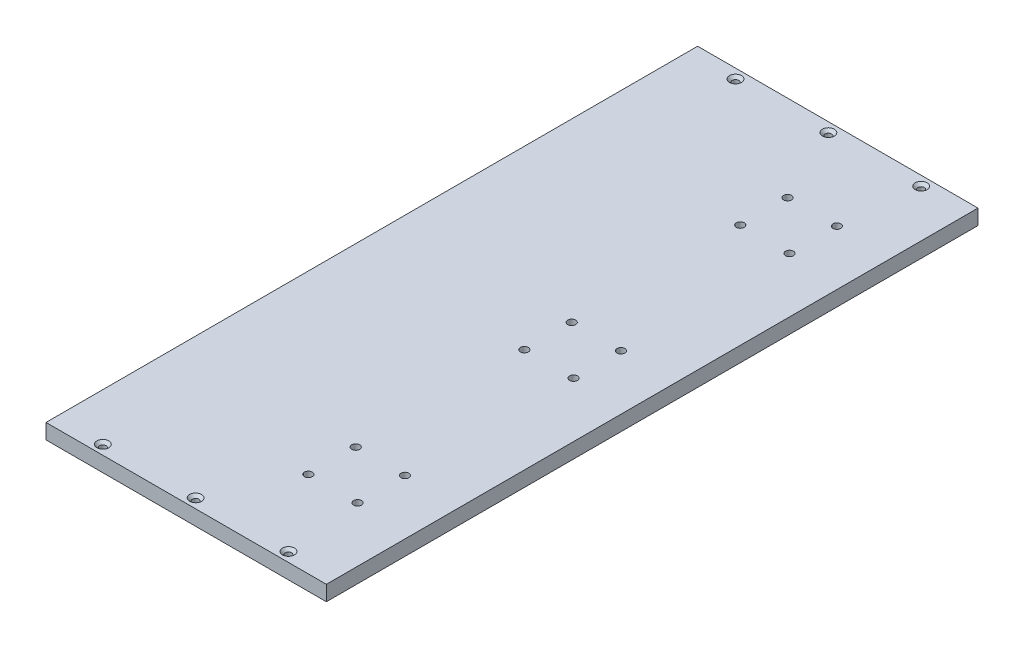
ISO-10303-21;
HEADER;
FILE_DESCRIPTION(('STEP AP214'),'2;1');
FILE_NAME('part.step','',(''),(''),'','','');
FILE_SCHEMA(('AUTOMOTIVE_DESIGN { 1 0 10303 214 1 1 1 1 }'));
ENDSEC;
DATA;
#1=APPLICATION_CONTEXT('core data for automotive mechanical design processes');
#2=APPLICATION_PROTOCOL_DEFINITION('international standard','automotive_design',2000,#1);
#3=PRODUCT_CONTEXT('',#1,'mechanical');
#4=PRODUCT('Part','Part','',(#3));
#5=PRODUCT_RELATED_PRODUCT_CATEGORY('part','',(#4));
#6=PRODUCT_DEFINITION_FORMATION('','',#4);
#7=PRODUCT_DEFINITION_CONTEXT('part definition',#1,'design');
#8=PRODUCT_DEFINITION('design','',#6,#7);
#9=PRODUCT_DEFINITION_SHAPE('','',#8);
#10=(LENGTH_UNIT() NAMED_UNIT(*) SI_UNIT(.MILLI.,.METRE.));
#11=(NAMED_UNIT(*) PLANE_ANGLE_UNIT() SI_UNIT($,.RADIAN.));
#12=(NAMED_UNIT(*) SI_UNIT($,.STERADIAN.) SOLID_ANGLE_UNIT());
#13=UNCERTAINTY_MEASURE_WITH_UNIT(LENGTH_MEASURE(1.E-05),#10,'distance_accuracy_value','');
#14=(GEOMETRIC_REPRESENTATION_CONTEXT(3) GLOBAL_UNCERTAINTY_ASSIGNED_CONTEXT((#13)) GLOBAL_UNIT_ASSIGNED_CONTEXT((#10,
#11,#12)) REPRESENTATION_CONTEXT('',''));
#15=CARTESIAN_POINT('',(0.,0.,0.));
#16=DIRECTION('',(0.,0.,1.));
#17=DIRECTION('',(1.,0.,0.));
#18=AXIS2_PLACEMENT_3D('',#15,#16,#17);
#19=CARTESIAN_POINT('',(0.,8.,0.));
#20=DIRECTION('',(0.,-1.,0.));
#21=DIRECTION('',(0.,0.,-1.));
#22=AXIS2_PLACEMENT_3D('',#19,#20,#21);
#23=PLANE('',#22);
#24=CARTESIAN_POINT('',(45.,8.,-101.5));
#25=DIRECTION('',(0.,1.,0.));
#26=DIRECTION('',(0.,0.,1.));
#27=AXIS2_PLACEMENT_3D('',#24,#25,#26);
#28=CIRCLE('',#27,2.1);
#29=CARTESIAN_POINT('',(45.,8.,-99.4));
#30=VERTEX_POINT('',#29);
#31=EDGE_CURVE('E254',#30,#30,#28,.T.);
#32=ORIENTED_EDGE('',*,*,#31,.F.);
#33=EDGE_LOOP('',(#32));
#34=FACE_BOUND('',#33,.T.);
#35=CARTESIAN_POINT('',(19.,8.,-12.5));
#36=DIRECTION('',(0.,1.,0.));
#37=DIRECTION('',(0.,0.,1.));
#38=AXIS2_PLACEMENT_3D('',#35,#36,#37);
#39=CIRCLE('',#38,2.1);
#40=CARTESIAN_POINT('',(19.,8.,-10.4));
#41=VERTEX_POINT('',#40);
#42=EDGE_CURVE('E266',#41,#41,#39,.T.);
#43=ORIENTED_EDGE('',*,*,#42,.F.);
#44=EDGE_LOOP('',(#43));
#45=FACE_BOUND('',#44,.T.);
#46=CARTESIAN_POINT('',(19.,8.,12.5));
#47=DIRECTION('',(0.,1.,0.));
#48=DIRECTION('',(0.,0.,1.));
#49=AXIS2_PLACEMENT_3D('',#46,#47,#48);
#50=CIRCLE('',#49,2.1);
#51=CARTESIAN_POINT('',(19.,8.,14.6));
#52=VERTEX_POINT('',#51);
#53=EDGE_CURVE('E272',#52,#52,#50,.T.);
#54=ORIENTED_EDGE('',*,*,#53,.F.);
#55=EDGE_LOOP('',(#54));
#56=FACE_BOUND('',#55,.T.);
#57=CARTESIAN_POINT('',(45.,8.,12.5));
#58=DIRECTION('',(0.,1.,0.));
#59=DIRECTION('',(0.,0.,1.));
#60=AXIS2_PLACEMENT_3D('',#57,#58,#59);
#61=CIRCLE('',#60,2.1);
#62=CARTESIAN_POINT('',(45.,8.,14.6));
#63=VERTEX_POINT('',#62);
#64=EDGE_CURVE('E278',#63,#63,#61,.T.);
#65=ORIENTED_EDGE('',*,*,#64,.F.);
#66=EDGE_LOOP('',(#65));
#67=FACE_BOUND('',#66,.T.);
#68=CARTESIAN_POINT('',(-49.,8.,-167.));
#69=DIRECTION('',(0.,1.,0.));
#70=DIRECTION('',(0.,0.,1.));
#71=AXIS2_PLACEMENT_3D('',#68,#69,#70);
#72=CIRCLE('',#71,3.15);
#73=CARTESIAN_POINT('',(-49.,8.,-163.85));
#74=VERTEX_POINT('',#73);
#75=EDGE_CURVE('E284',#74,#74,#72,.T.);
#76=ORIENTED_EDGE('',*,*,#75,.F.);
#77=EDGE_LOOP('',(#76));
#78=FACE_BOUND('',#77,.T.);
#79=CARTESIAN_POINT('',(-49.,8.,167.));
#80=DIRECTION('',(0.,1.,0.));
#81=DIRECTION('',(0.,0.,1.));
#82=AXIS2_PLACEMENT_3D('',#79,#80,#81);
#83=CIRCLE('',#82,3.15);
#84=CARTESIAN_POINT('',(-49.,8.,170.15));
#85=VERTEX_POINT('',#84);
#86=EDGE_CURVE('E139',#85,#85,#83,.T.);
#87=ORIENTED_EDGE('',*,*,#86,.F.);
#88=EDGE_LOOP('',(#87));
#89=FACE_BOUND('',#88,.T.);
#90=CARTESIAN_POINT('',(0.,8.,167.));
#91=DIRECTION('',(0.,1.,0.));
#92=DIRECTION('',(0.,0.,1.));
#93=AXIS2_PLACEMENT_3D('',#90,#91,#92);
#94=CIRCLE('',#93,3.15);
#95=CARTESIAN_POINT('',(0.,8.,170.15));
#96=VERTEX_POINT('',#95);
#97=EDGE_CURVE('E135',#96,#96,#94,.T.);
#98=ORIENTED_EDGE('',*,*,#97,.F.);
#99=EDGE_LOOP('',(#98));
#100=FACE_BOUND('',#99,.T.);
#101=CARTESIAN_POINT('',(49.,8.,167.));
#102=DIRECTION('',(0.,1.,0.));
#103=DIRECTION('',(0.,0.,1.));
#104=AXIS2_PLACEMENT_3D('',#101,#102,#103);
#105=CIRCLE('',#104,3.15);
#106=CARTESIAN_POINT('',(49.,8.,170.15));
#107=VERTEX_POINT('',#106);
#108=EDGE_CURVE('E130',#107,#107,#105,.T.);
#109=ORIENTED_EDGE('',*,*,#108,.F.);
#110=EDGE_LOOP('',(#109));
#111=FACE_BOUND('',#110,.T.);
#112=DIRECTION('',(0.,0.,-1.));
#113=VECTOR('',#112,1.);
#114=CARTESIAN_POINT('',(74.,8.,172.));
#115=LINE('',#114,#113);
#116=CARTESIAN_POINT('',(74.,8.,172.));
#117=VERTEX_POINT('',#116);
#118=CARTESIAN_POINT('',(74.,8.,-172.));
#119=VERTEX_POINT('',#118);
#120=EDGE_CURVE('E102',#117,#119,#115,.T.);
#121=ORIENTED_EDGE('',*,*,#120,.T.);
#122=DIRECTION('',(-1.,0.,0.));
#123=VECTOR('',#122,1.);
#124=CARTESIAN_POINT('',(-74.,8.,-172.));
#125=LINE('',#124,#123);
#126=CARTESIAN_POINT('',(-74.,8.,-172.));
#127=VERTEX_POINT('',#126);
#128=EDGE_CURVE('E97',#119,#127,#125,.T.);
#129=ORIENTED_EDGE('',*,*,#128,.T.);
#130=DIRECTION('',(0.,0.,1.));
#131=VECTOR('',#130,1.);
#132=CARTESIAN_POINT('',(-74.,8.,172.));
#133=LINE('',#132,#131);
#134=CARTESIAN_POINT('',(-74.,8.,172.));
#135=VERTEX_POINT('',#134);
#136=EDGE_CURVE('E100',#127,#135,#133,.T.);
#137=ORIENTED_EDGE('',*,*,#136,.T.);
#138=DIRECTION('',(1.,0.,0.));
#139=VECTOR('',#138,1.);
#140=CARTESIAN_POINT('',(-74.,8.,172.));
#141=LINE('',#140,#139);
#142=EDGE_CURVE('E67',#135,#117,#141,.T.);
#143=ORIENTED_EDGE('',*,*,#142,.T.);
#144=EDGE_LOOP('',(#121,#129,#137,#143));
#145=FACE_BOUND('',#144,.T.);
#146=CARTESIAN_POINT('',(49.,8.,-167.));
#147=DIRECTION('',(0.,1.,0.));
#148=DIRECTION('',(0.,0.,1.));
#149=AXIS2_PLACEMENT_3D('',#146,#147,#148);
#150=CIRCLE('',#149,3.15);
#151=CARTESIAN_POINT('',(49.,8.,-163.85));
#152=VERTEX_POINT('',#151);
#153=EDGE_CURVE('E143',#152,#152,#150,.T.);
#154=ORIENTED_EDGE('',*,*,#153,.F.);
#155=EDGE_LOOP('',(#154));
#156=FACE_BOUND('',#155,.T.);
#157=CARTESIAN_POINT('',(0.,8.,-167.));
#158=DIRECTION('',(0.,1.,0.));
#159=DIRECTION('',(0.,0.,1.));
#160=AXIS2_PLACEMENT_3D('',#157,#158,#159);
#161=CIRCLE('',#160,3.15);
#162=CARTESIAN_POINT('',(0.,8.,-163.85));
#163=VERTEX_POINT('',#162);
#164=EDGE_CURVE('E150',#163,#163,#161,.T.);
#165=ORIENTED_EDGE('',*,*,#164,.F.);
#166=EDGE_LOOP('',(#165));
#167=FACE_BOUND('',#166,.T.);
#168=CARTESIAN_POINT('',(45.,8.,-12.5));
#169=DIRECTION('',(0.,1.,0.));
#170=DIRECTION('',(0.,0.,1.));
#171=AXIS2_PLACEMENT_3D('',#168,#169,#170);
#172=CIRCLE('',#171,2.1);
#173=CARTESIAN_POINT('',(45.,8.,-10.4));
#174=VERTEX_POINT('',#173);
#175=EDGE_CURVE('E260',#174,#174,#172,.T.);
#176=ORIENTED_EDGE('',*,*,#175,.F.);
#177=EDGE_LOOP('',(#176));
#178=FACE_BOUND('',#177,.T.);
#179=CARTESIAN_POINT('',(19.,8.,-101.5));
#180=DIRECTION('',(0.,1.,0.));
#181=DIRECTION('',(0.,0.,1.));
#182=AXIS2_PLACEMENT_3D('',#179,#180,#181);
#183=CIRCLE('',#182,2.1);
#184=CARTESIAN_POINT('',(19.,8.,-99.4));
#185=VERTEX_POINT('',#184);
#186=EDGE_CURVE('E250',#185,#185,#183,.T.);
#187=ORIENTED_EDGE('',*,*,#186,.F.);
#188=EDGE_LOOP('',(#187));
#189=FACE_BOUND('',#188,.T.);
#190=CARTESIAN_POINT('',(19.,8.,-126.5));
#191=DIRECTION('',(0.,1.,0.));
#192=DIRECTION('',(0.,0.,1.));
#193=AXIS2_PLACEMENT_3D('',#190,#191,#192);
#194=CIRCLE('',#193,2.1);
#195=CARTESIAN_POINT('',(19.,8.,-124.4));
#196=VERTEX_POINT('',#195);
#197=EDGE_CURVE('E244',#196,#196,#194,.T.);
#198=ORIENTED_EDGE('',*,*,#197,.F.);
#199=EDGE_LOOP('',(#198));
#200=FACE_BOUND('',#199,.T.);
#201=CARTESIAN_POINT('',(45.,8.,-126.5));
#202=DIRECTION('',(0.,1.,0.));
#203=DIRECTION('',(0.,0.,1.));
#204=AXIS2_PLACEMENT_3D('',#201,#202,#203);
#205=CIRCLE('',#204,2.1);
#206=CARTESIAN_POINT('',(45.,8.,-124.4));
#207=VERTEX_POINT('',#206);
#208=EDGE_CURVE('E238',#207,#207,#205,.T.);
#209=ORIENTED_EDGE('',*,*,#208,.F.);
#210=EDGE_LOOP('',(#209));
#211=FACE_BOUND('',#210,.T.);
#212=CARTESIAN_POINT('',(45.,8.,126.5));
#213=DIRECTION('',(0.,1.,0.));
#214=DIRECTION('',(0.,0.,1.));
#215=AXIS2_PLACEMENT_3D('',#212,#213,#214);
#216=CIRCLE('',#215,2.1);
#217=CARTESIAN_POINT('',(45.,8.,128.6));
#218=VERTEX_POINT('',#217);
#219=EDGE_CURVE('E232',#218,#218,#216,.T.);
#220=ORIENTED_EDGE('',*,*,#219,.F.);
#221=EDGE_LOOP('',(#220));
#222=FACE_BOUND('',#221,.T.);
#223=CARTESIAN_POINT('',(19.,8.,126.5));
#224=DIRECTION('',(0.,1.,0.));
#225=DIRECTION('',(0.,0.,1.));
#226=AXIS2_PLACEMENT_3D('',#223,#224,#225);
#227=CIRCLE('',#226,2.1);
#228=CARTESIAN_POINT('',(19.,8.,128.6));
#229=VERTEX_POINT('',#228);
#230=EDGE_CURVE('E221',#229,#229,#227,.T.);
#231=ORIENTED_EDGE('',*,*,#230,.F.);
#232=EDGE_LOOP('',(#231));
#233=FACE_BOUND('',#232,.T.);
#234=CARTESIAN_POINT('',(19.,8.,101.5));
#235=DIRECTION('',(0.,1.,0.));
#236=DIRECTION('',(0.,0.,1.));
#237=AXIS2_PLACEMENT_3D('',#234,#235,#236);
#238=CIRCLE('',#237,2.1);
#239=CARTESIAN_POINT('',(19.,8.,103.6));
#240=VERTEX_POINT('',#239);
#241=EDGE_CURVE('E222',#240,#240,#238,.T.);
#242=ORIENTED_EDGE('',*,*,#241,.F.);
#243=EDGE_LOOP('',(#242));
#244=FACE_BOUND('',#243,.T.);
#245=CARTESIAN_POINT('',(45.,8.,101.5));
#246=DIRECTION('',(0.,1.,0.));
#247=DIRECTION('',(0.,0.,1.));
#248=AXIS2_PLACEMENT_3D('',#245,#246,#247);
#249=CIRCLE('',#248,2.1);
#250=CARTESIAN_POINT('',(45.,8.,103.6));
#251=VERTEX_POINT('',#250);
#252=EDGE_CURVE('E592',#251,#251,#249,.T.);
#253=ORIENTED_EDGE('',*,*,#252,.F.);
#254=EDGE_LOOP('',(#253));
#255=FACE_BOUND('',#254,.T.);
#256=ADVANCED_FACE('F48',(#34,#45,#56,#67,#78,#89,#100,#111,#145,#156,#167,#178,#189,#200,#211,
#222,#233,#244,#255),#23,.F.);
#257=CARTESIAN_POINT('',(0.,0.,0.));
#258=DIRECTION('',(0.,-1.,0.));
#259=DIRECTION('',(0.,0.,-1.));
#260=AXIS2_PLACEMENT_3D('',#257,#258,#259);
#261=PLANE('',#260);
#262=CARTESIAN_POINT('',(45.,0.,101.5));
#263=DIRECTION('',(0.,1.,0.));
#264=DIRECTION('',(0.,0.,1.));
#265=AXIS2_PLACEMENT_3D('',#262,#263,#264);
#266=CIRCLE('',#265,2.1);
#267=CARTESIAN_POINT('',(45.,0.,103.6));
#268=VERTEX_POINT('',#267);
#269=EDGE_CURVE('E227',#268,#268,#266,.T.);
#270=ORIENTED_EDGE('',*,*,#269,.T.);
#271=EDGE_LOOP('',(#270));
#272=FACE_BOUND('',#271,.T.);
#273=CARTESIAN_POINT('',(45.,0.,126.5));
#274=DIRECTION('',(0.,1.,0.));
#275=DIRECTION('',(0.,0.,1.));
#276=AXIS2_PLACEMENT_3D('',#273,#274,#275);
#277=CIRCLE('',#276,2.1);
#278=CARTESIAN_POINT('',(45.,0.,128.6));
#279=VERTEX_POINT('',#278);
#280=EDGE_CURVE('E235',#279,#279,#277,.T.);
#281=ORIENTED_EDGE('',*,*,#280,.T.);
#282=EDGE_LOOP('',(#281));
#283=FACE_BOUND('',#282,.T.);
#284=CARTESIAN_POINT('',(45.,0.,-126.5));
#285=DIRECTION('',(0.,1.,0.));
#286=DIRECTION('',(0.,0.,1.));
#287=AXIS2_PLACEMENT_3D('',#284,#285,#286);
#288=CIRCLE('',#287,2.1);
#289=CARTESIAN_POINT('',(45.,0.,-124.4));
#290=VERTEX_POINT('',#289);
#291=EDGE_CURVE('E241',#290,#290,#288,.T.);
#292=ORIENTED_EDGE('',*,*,#291,.T.);
#293=EDGE_LOOP('',(#292));
#294=FACE_BOUND('',#293,.T.);
#295=CARTESIAN_POINT('',(19.,0.,-126.5));
#296=DIRECTION('',(0.,1.,0.));
#297=DIRECTION('',(0.,0.,1.));
#298=AXIS2_PLACEMENT_3D('',#295,#296,#297);
#299=CIRCLE('',#298,2.1);
#300=CARTESIAN_POINT('',(19.,0.,-124.4));
#301=VERTEX_POINT('',#300);
#302=EDGE_CURVE('E247',#301,#301,#299,.T.);
#303=ORIENTED_EDGE('',*,*,#302,.T.);
#304=EDGE_LOOP('',(#303));
#305=FACE_BOUND('',#304,.T.);
#306=CARTESIAN_POINT('',(45.,0.,-101.5));
#307=DIRECTION('',(0.,1.,0.));
#308=DIRECTION('',(0.,0.,1.));
#309=AXIS2_PLACEMENT_3D('',#306,#307,#308);
#310=CIRCLE('',#309,2.1);
#311=CARTESIAN_POINT('',(45.,0.,-99.4));
#312=VERTEX_POINT('',#311);
#313=EDGE_CURVE('E257',#312,#312,#310,.T.);
#314=ORIENTED_EDGE('',*,*,#313,.T.);
#315=EDGE_LOOP('',(#314));
#316=FACE_BOUND('',#315,.T.);
#317=CARTESIAN_POINT('',(45.,0.,-12.5));
#318=DIRECTION('',(0.,1.,0.));
#319=DIRECTION('',(0.,0.,1.));
#320=AXIS2_PLACEMENT_3D('',#317,#318,#319);
#321=CIRCLE('',#320,2.1);
#322=CARTESIAN_POINT('',(45.,0.,-10.4));
#323=VERTEX_POINT('',#322);
#324=EDGE_CURVE('E263',#323,#323,#321,.T.);
#325=ORIENTED_EDGE('',*,*,#324,.T.);
#326=EDGE_LOOP('',(#325));
#327=FACE_BOUND('',#326,.T.);
#328=CARTESIAN_POINT('',(19.,0.,-12.5));
#329=DIRECTION('',(0.,1.,0.));
#330=DIRECTION('',(0.,0.,1.));
#331=AXIS2_PLACEMENT_3D('',#328,#329,#330);
#332=CIRCLE('',#331,2.1);
#333=CARTESIAN_POINT('',(19.,0.,-10.4));
#334=VERTEX_POINT('',#333);
#335=EDGE_CURVE('E269',#334,#334,#332,.T.);
#336=ORIENTED_EDGE('',*,*,#335,.T.);
#337=EDGE_LOOP('',(#336));
#338=FACE_BOUND('',#337,.T.);
#339=CARTESIAN_POINT('',(19.,0.,12.5));
#340=DIRECTION('',(0.,1.,0.));
#341=DIRECTION('',(0.,0.,1.));
#342=AXIS2_PLACEMENT_3D('',#339,#340,#341);
#343=CIRCLE('',#342,2.1);
#344=CARTESIAN_POINT('',(19.,0.,14.6));
#345=VERTEX_POINT('',#344);
#346=EDGE_CURVE('E275',#345,#345,#343,.T.);
#347=ORIENTED_EDGE('',*,*,#346,.T.);
#348=EDGE_LOOP('',(#347));
#349=FACE_BOUND('',#348,.T.);
#350=CARTESIAN_POINT('',(45.,0.,12.5));
#351=DIRECTION('',(0.,1.,0.));
#352=DIRECTION('',(0.,0.,1.));
#353=AXIS2_PLACEMENT_3D('',#350,#351,#352);
#354=CIRCLE('',#353,2.1);
#355=CARTESIAN_POINT('',(45.,0.,14.6));
#356=VERTEX_POINT('',#355);
#357=EDGE_CURVE('E281',#356,#356,#354,.T.);
#358=ORIENTED_EDGE('',*,*,#357,.T.);
#359=EDGE_LOOP('',(#358));
#360=FACE_BOUND('',#359,.T.);
#361=CARTESIAN_POINT('',(-49.,0.,-167.));
#362=DIRECTION('',(0.,-1.,0.));
#363=DIRECTION('',(0.,0.,-1.));
#364=AXIS2_PLACEMENT_3D('',#361,#362,#363);
#365=CIRCLE('',#364,1.7);
#366=CARTESIAN_POINT('',(-49.,0.,-168.7));
#367=VERTEX_POINT('',#366);
#368=EDGE_CURVE('E52',#367,#367,#365,.T.);
#369=ORIENTED_EDGE('',*,*,#368,.F.);
#370=EDGE_LOOP('',(#369));
#371=FACE_BOUND('',#370,.T.);
#372=CARTESIAN_POINT('',(0.,0.,-167.));
#373=DIRECTION('',(0.,-1.,0.));
#374=DIRECTION('',(0.,0.,-1.));
#375=AXIS2_PLACEMENT_3D('',#372,#373,#374);
#376=CIRCLE('',#375,1.7);
#377=CARTESIAN_POINT('',(0.,0.,-168.7));
#378=VERTEX_POINT('',#377);
#379=EDGE_CURVE('E141',#378,#378,#376,.T.);
#380=ORIENTED_EDGE('',*,*,#379,.F.);
#381=EDGE_LOOP('',(#380));
#382=FACE_BOUND('',#381,.T.);
#383=CARTESIAN_POINT('',(49.,0.,-167.));
#384=DIRECTION('',(0.,-1.,0.));
#385=DIRECTION('',(0.,0.,-1.));
#386=AXIS2_PLACEMENT_3D('',#383,#384,#385);
#387=CIRCLE('',#386,1.7);
#388=CARTESIAN_POINT('',(49.,0.,-168.7));
#389=VERTEX_POINT('',#388);
#390=EDGE_CURVE('E137',#389,#389,#387,.T.);
#391=ORIENTED_EDGE('',*,*,#390,.F.);
#392=EDGE_LOOP('',(#391));
#393=FACE_BOUND('',#392,.T.);
#394=CARTESIAN_POINT('',(-49.,0.,167.));
#395=DIRECTION('',(0.,-1.,0.));
#396=DIRECTION('',(0.,0.,-1.));
#397=AXIS2_PLACEMENT_3D('',#394,#395,#396);
#398=CIRCLE('',#397,1.7);
#399=CARTESIAN_POINT('',(-49.,0.,165.3));
#400=VERTEX_POINT('',#399);
#401=EDGE_CURVE('E132',#400,#400,#398,.T.);
#402=ORIENTED_EDGE('',*,*,#401,.F.);
#403=EDGE_LOOP('',(#402));
#404=FACE_BOUND('',#403,.T.);
#405=CARTESIAN_POINT('',(0.,0.,167.));
#406=DIRECTION('',(0.,-1.,0.));
#407=DIRECTION('',(0.,0.,-1.));
#408=AXIS2_PLACEMENT_3D('',#405,#406,#407);
#409=CIRCLE('',#408,1.7);
#410=CARTESIAN_POINT('',(0.,0.,165.3));
#411=VERTEX_POINT('',#410);
#412=EDGE_CURVE('E127',#411,#411,#409,.T.);
#413=ORIENTED_EDGE('',*,*,#412,.F.);
#414=EDGE_LOOP('',(#413));
#415=FACE_BOUND('',#414,.T.);
#416=CARTESIAN_POINT('',(49.,0.,167.));
#417=DIRECTION('',(0.,-1.,0.));
#418=DIRECTION('',(0.,0.,-1.));
#419=AXIS2_PLACEMENT_3D('',#416,#417,#418);
#420=CIRCLE('',#419,1.7);
#421=CARTESIAN_POINT('',(49.,0.,165.3));
#422=VERTEX_POINT('',#421);
#423=EDGE_CURVE('E118',#422,#422,#420,.T.);
#424=ORIENTED_EDGE('',*,*,#423,.F.);
#425=EDGE_LOOP('',(#424));
#426=FACE_BOUND('',#425,.T.);
#427=DIRECTION('',(0.,0.,-1.));
#428=VECTOR('',#427,1.);
#429=CARTESIAN_POINT('',(74.,0.,172.));
#430=LINE('',#429,#428);
#431=CARTESIAN_POINT('',(74.,0.,172.));
#432=VERTEX_POINT('',#431);
#433=CARTESIAN_POINT('',(74.,0.,-172.));
#434=VERTEX_POINT('',#433);
#435=EDGE_CURVE('E115',#432,#434,#430,.T.);
#436=ORIENTED_EDGE('',*,*,#435,.F.);
#437=DIRECTION('',(1.,0.,0.));
#438=VECTOR('',#437,1.);
#439=CARTESIAN_POINT('',(-74.,0.,172.));
#440=LINE('',#439,#438);
#441=CARTESIAN_POINT('',(-74.,0.,172.));
#442=VERTEX_POINT('',#441);
#443=EDGE_CURVE('E90',#442,#432,#440,.T.);
#444=ORIENTED_EDGE('',*,*,#443,.F.);
#445=DIRECTION('',(0.,0.,1.));
#446=VECTOR('',#445,1.);
#447=CARTESIAN_POINT('',(-74.,0.,172.));
#448=LINE('',#447,#446);
#449=CARTESIAN_POINT('',(-74.,0.,-172.));
#450=VERTEX_POINT('',#449);
#451=EDGE_CURVE('E84',#450,#442,#448,.T.);
#452=ORIENTED_EDGE('',*,*,#451,.F.);
#453=DIRECTION('',(-1.,0.,0.));
#454=VECTOR('',#453,1.);
#455=CARTESIAN_POINT('',(-74.,0.,-172.));
#456=LINE('',#455,#454);
#457=EDGE_CURVE('E106',#434,#450,#456,.T.);
#458=ORIENTED_EDGE('',*,*,#457,.F.);
#459=EDGE_LOOP('',(#436,#444,#452,#458));
#460=FACE_BOUND('',#459,.T.);
#461=CARTESIAN_POINT('',(19.,0.,-101.5));
#462=DIRECTION('',(0.,1.,0.));
#463=DIRECTION('',(0.,0.,1.));
#464=AXIS2_PLACEMENT_3D('',#461,#462,#463);
#465=CIRCLE('',#464,2.1);
#466=CARTESIAN_POINT('',(19.,0.,-99.4));
#467=VERTEX_POINT('',#466);
#468=EDGE_CURVE('E212',#467,#467,#465,.T.);
#469=ORIENTED_EDGE('',*,*,#468,.T.);
#470=EDGE_LOOP('',(#469));
#471=FACE_BOUND('',#470,.T.);
#472=CARTESIAN_POINT('',(19.,0.,126.5));
#473=DIRECTION('',(0.,1.,0.));
#474=DIRECTION('',(0.,0.,1.));
#475=AXIS2_PLACEMENT_3D('',#472,#473,#474);
#476=CIRCLE('',#475,2.1);
#477=CARTESIAN_POINT('',(19.,0.,128.6));
#478=VERTEX_POINT('',#477);
#479=EDGE_CURVE('E216',#478,#478,#476,.T.);
#480=ORIENTED_EDGE('',*,*,#479,.T.);
#481=EDGE_LOOP('',(#480));
#482=FACE_BOUND('',#481,.T.);
#483=CARTESIAN_POINT('',(19.,0.,101.5));
#484=DIRECTION('',(0.,1.,0.));
#485=DIRECTION('',(0.,0.,1.));
#486=AXIS2_PLACEMENT_3D('',#483,#484,#485);
#487=CIRCLE('',#486,2.1);
#488=CARTESIAN_POINT('',(19.,0.,103.6));
#489=VERTEX_POINT('',#488);
#490=EDGE_CURVE('E219',#489,#489,#487,.T.);
#491=ORIENTED_EDGE('',*,*,#490,.T.);
#492=EDGE_LOOP('',(#491));
#493=FACE_BOUND('',#492,.T.);
#494=ADVANCED_FACE('F183',(#272,#283,#294,#305,#316,#327,#338,#349,#360,#371,#382,#393,#404,
#415,#426,#460,#471,#482,#493),#261,.T.);
#495=CARTESIAN_POINT('',(74.,8.,172.));
#496=DIRECTION('',(-1.,0.,0.));
#497=DIRECTION('',(0.,0.,1.));
#498=AXIS2_PLACEMENT_3D('',#495,#496,#497);
#499=PLANE('',#498);
#500=ORIENTED_EDGE('',*,*,#435,.T.);
#501=DIRECTION('',(0.,-1.,0.));
#502=VECTOR('',#501,1.);
#503=CARTESIAN_POINT('',(74.,8.,-172.));
#504=LINE('',#503,#502);
#505=EDGE_CURVE('E13',#119,#434,#504,.T.);
#506=ORIENTED_EDGE('',*,*,#505,.F.);
#507=ORIENTED_EDGE('',*,*,#120,.F.);
#508=DIRECTION('',(0.,-1.,0.));
#509=VECTOR('',#508,1.);
#510=CARTESIAN_POINT('',(74.,8.,172.));
#511=LINE('',#510,#509);
#512=EDGE_CURVE('E111',#117,#432,#511,.T.);
#513=ORIENTED_EDGE('',*,*,#512,.T.);
#514=EDGE_LOOP('',(#500,#506,#507,#513));
#515=FACE_BOUND('',#514,.T.);
#516=ADVANCED_FACE('F50',(#515),#499,.F.);
#517=CARTESIAN_POINT('',(-74.,8.,-172.));
#518=DIRECTION('',(0.,0.,1.));
#519=DIRECTION('',(1.,0.,0.));
#520=AXIS2_PLACEMENT_3D('',#517,#518,#519);
#521=PLANE('',#520);
#522=ORIENTED_EDGE('',*,*,#457,.T.);
#523=DIRECTION('',(0.,-1.,0.));
#524=VECTOR('',#523,1.);
#525=CARTESIAN_POINT('',(-74.,8.,-172.));
#526=LINE('',#525,#524);
#527=EDGE_CURVE('E58',#127,#450,#526,.T.);
#528=ORIENTED_EDGE('',*,*,#527,.F.);
#529=ORIENTED_EDGE('',*,*,#128,.F.);
#530=ORIENTED_EDGE('',*,*,#505,.T.);
#531=EDGE_LOOP('',(#522,#528,#529,#530));
#532=FACE_BOUND('',#531,.T.);
#533=ADVANCED_FACE('F105',(#532),#521,.F.);
#534=CARTESIAN_POINT('',(-74.,8.,172.));
#535=DIRECTION('',(1.,0.,0.));
#536=DIRECTION('',(0.,0.,-1.));
#537=AXIS2_PLACEMENT_3D('',#534,#535,#536);
#538=PLANE('',#537);
#539=ORIENTED_EDGE('',*,*,#451,.T.);
#540=DIRECTION('',(0.,-1.,0.));
#541=VECTOR('',#540,1.);
#542=CARTESIAN_POINT('',(-74.,8.,172.));
#543=LINE('',#542,#541);
#544=EDGE_CURVE('E107',#135,#442,#543,.T.);
#545=ORIENTED_EDGE('',*,*,#544,.F.);
#546=ORIENTED_EDGE('',*,*,#136,.F.);
#547=ORIENTED_EDGE('',*,*,#527,.T.);
#548=EDGE_LOOP('',(#539,#545,#546,#547));
#549=FACE_BOUND('',#548,.T.);
#550=ADVANCED_FACE('F109',(#549),#538,.F.);
#551=CARTESIAN_POINT('',(-74.,8.,172.));
#552=DIRECTION('',(0.,0.,-1.));
#553=DIRECTION('',(-1.,0.,0.));
#554=AXIS2_PLACEMENT_3D('',#551,#552,#553);
#555=PLANE('',#554);
#556=ORIENTED_EDGE('',*,*,#443,.T.);
#557=ORIENTED_EDGE('',*,*,#512,.F.);
#558=ORIENTED_EDGE('',*,*,#142,.F.);
#559=ORIENTED_EDGE('',*,*,#544,.T.);
#560=EDGE_LOOP('',(#556,#557,#558,#559));
#561=FACE_BOUND('',#560,.T.);
#562=ADVANCED_FACE('F195',(#561),#555,.F.);
#563=CARTESIAN_POINT('',(49.,8.,167.));
#564=DIRECTION('',(0.,1.,0.));
#565=DIRECTION('',(0.,0.,1.));
#566=AXIS2_PLACEMENT_3D('',#563,#564,#565);
#567=CYLINDRICAL_SURFACE('',#566,1.7);
#568=ORIENTED_EDGE('',*,*,#423,.T.);
#569=EDGE_LOOP('',(#568));
#570=FACE_BOUND('',#569,.T.);
#571=CARTESIAN_POINT('',(49.,6.55,167.));
#572=DIRECTION('',(0.,1.,0.));
#573=DIRECTION('',(0.,0.,1.));
#574=AXIS2_PLACEMENT_3D('',#571,#572,#573);
#575=CIRCLE('',#574,1.7);
#576=CARTESIAN_POINT('',(49.,6.55,168.7));
#577=VERTEX_POINT('',#576);
#578=EDGE_CURVE('E126',#577,#577,#575,.T.);
#579=ORIENTED_EDGE('',*,*,#578,.T.);
#580=EDGE_LOOP('',(#579));
#581=FACE_BOUND('',#580,.T.);
#582=ADVANCED_FACE('F173',(#570,#581),#567,.F.);
#583=CARTESIAN_POINT('',(49.,8.,167.));
#584=DIRECTION('',(0.,1.,0.));
#585=DIRECTION('',(0.,0.,1.));
#586=AXIS2_PLACEMENT_3D('',#583,#584,#585);
#587=CONICAL_SURFACE('',#586,3.15,0.785398163397448);
#588=ORIENTED_EDGE('',*,*,#578,.F.);
#589=EDGE_LOOP('',(#588));
#590=FACE_BOUND('',#589,.T.);
#591=ORIENTED_EDGE('',*,*,#108,.T.);
#592=EDGE_LOOP('',(#591));
#593=FACE_BOUND('',#592,.T.);
#594=ADVANCED_FACE('F175',(#590,#593),#587,.F.);
#595=CARTESIAN_POINT('',(0.,8.,167.));
#596=DIRECTION('',(0.,1.,0.));
#597=DIRECTION('',(0.,0.,1.));
#598=AXIS2_PLACEMENT_3D('',#595,#596,#597);
#599=CYLINDRICAL_SURFACE('',#598,1.7);
#600=ORIENTED_EDGE('',*,*,#412,.T.);
#601=EDGE_LOOP('',(#600));
#602=FACE_BOUND('',#601,.T.);
#603=CARTESIAN_POINT('',(0.,6.55,167.));
#604=DIRECTION('',(0.,1.,0.));
#605=DIRECTION('',(0.,0.,1.));
#606=AXIS2_PLACEMENT_3D('',#603,#604,#605);
#607=CIRCLE('',#606,1.7);
#608=CARTESIAN_POINT('',(0.,6.55,168.7));
#609=VERTEX_POINT('',#608);
#610=EDGE_CURVE('E131',#609,#609,#607,.T.);
#611=ORIENTED_EDGE('',*,*,#610,.T.);
#612=EDGE_LOOP('',(#611));
#613=FACE_BOUND('',#612,.T.);
#614=ADVANCED_FACE('F178',(#602,#613),#599,.F.);
#615=CARTESIAN_POINT('',(0.,8.,167.));
#616=DIRECTION('',(0.,1.,0.));
#617=DIRECTION('',(0.,0.,1.));
#618=AXIS2_PLACEMENT_3D('',#615,#616,#617);
#619=CONICAL_SURFACE('',#618,3.15,0.785398163397449);
#620=ORIENTED_EDGE('',*,*,#610,.F.);
#621=EDGE_LOOP('',(#620));
#622=FACE_BOUND('',#621,.T.);
#623=ORIENTED_EDGE('',*,*,#97,.T.);
#624=EDGE_LOOP('',(#623));
#625=FACE_BOUND('',#624,.T.);
#626=ADVANCED_FACE('F320',(#622,#625),#619,.F.);
#627=CARTESIAN_POINT('',(-49.,8.,167.));
#628=DIRECTION('',(0.,1.,0.));
#629=DIRECTION('',(0.,0.,1.));
#630=AXIS2_PLACEMENT_3D('',#627,#628,#629);
#631=CYLINDRICAL_SURFACE('',#630,1.7);
#632=ORIENTED_EDGE('',*,*,#401,.T.);
#633=EDGE_LOOP('',(#632));
#634=FACE_BOUND('',#633,.T.);
#635=CARTESIAN_POINT('',(-49.,6.55,167.));
#636=DIRECTION('',(0.,1.,0.));
#637=DIRECTION('',(0.,0.,1.));
#638=AXIS2_PLACEMENT_3D('',#635,#636,#637);
#639=CIRCLE('',#638,1.7);
#640=CARTESIAN_POINT('',(-49.,6.55,168.7));
#641=VERTEX_POINT('',#640);
#642=EDGE_CURVE('E136',#641,#641,#639,.T.);
#643=ORIENTED_EDGE('',*,*,#642,.T.);
#644=EDGE_LOOP('',(#643));
#645=FACE_BOUND('',#644,.T.);
#646=ADVANCED_FACE('F328',(#634,#645),#631,.F.);
#647=CARTESIAN_POINT('',(-49.,8.,167.));
#648=DIRECTION('',(0.,1.,0.));
#649=DIRECTION('',(0.,0.,1.));
#650=AXIS2_PLACEMENT_3D('',#647,#648,#649);
#651=CONICAL_SURFACE('',#650,3.15,0.785398163397448);
#652=ORIENTED_EDGE('',*,*,#642,.F.);
#653=EDGE_LOOP('',(#652));
#654=FACE_BOUND('',#653,.T.);
#655=ORIENTED_EDGE('',*,*,#86,.T.);
#656=EDGE_LOOP('',(#655));
#657=FACE_BOUND('',#656,.T.);
#658=ADVANCED_FACE('F336',(#654,#657),#651,.F.);
#659=CARTESIAN_POINT('',(49.,8.,-167.));
#660=DIRECTION('',(0.,1.,0.));
#661=DIRECTION('',(0.,0.,1.));
#662=AXIS2_PLACEMENT_3D('',#659,#660,#661);
#663=CYLINDRICAL_SURFACE('',#662,1.7);
#664=ORIENTED_EDGE('',*,*,#390,.T.);
#665=EDGE_LOOP('',(#664));
#666=FACE_BOUND('',#665,.T.);
#667=CARTESIAN_POINT('',(49.,6.55,-167.));
#668=DIRECTION('',(0.,1.,0.));
#669=DIRECTION('',(0.,0.,1.));
#670=AXIS2_PLACEMENT_3D('',#667,#668,#669);
#671=CIRCLE('',#670,1.7);
#672=CARTESIAN_POINT('',(49.,6.55,-165.3));
#673=VERTEX_POINT('',#672);
#674=EDGE_CURVE('E140',#673,#673,#671,.T.);
#675=ORIENTED_EDGE('',*,*,#674,.T.);
#676=EDGE_LOOP('',(#675));
#677=FACE_BOUND('',#676,.T.);
#678=ADVANCED_FACE('F344',(#666,#677),#663,.F.);
#679=CARTESIAN_POINT('',(49.,8.,-167.));
#680=DIRECTION('',(0.,1.,0.));
#681=DIRECTION('',(0.,0.,1.));
#682=AXIS2_PLACEMENT_3D('',#679,#680,#681);
#683=CONICAL_SURFACE('',#682,3.15,0.785398163397448);
#684=ORIENTED_EDGE('',*,*,#674,.F.);
#685=EDGE_LOOP('',(#684));
#686=FACE_BOUND('',#685,.T.);
#687=ORIENTED_EDGE('',*,*,#153,.T.);
#688=EDGE_LOOP('',(#687));
#689=FACE_BOUND('',#688,.T.);
#690=ADVANCED_FACE('F352',(#686,#689),#683,.F.);
#691=CARTESIAN_POINT('',(0.,8.,-167.));
#692=DIRECTION('',(0.,1.,0.));
#693=DIRECTION('',(0.,0.,1.));
#694=AXIS2_PLACEMENT_3D('',#691,#692,#693);
#695=CYLINDRICAL_SURFACE('',#694,1.7);
#696=ORIENTED_EDGE('',*,*,#379,.T.);
#697=EDGE_LOOP('',(#696));
#698=FACE_BOUND('',#697,.T.);
#699=CARTESIAN_POINT('',(0.,6.55,-167.));
#700=DIRECTION('',(0.,1.,0.));
#701=DIRECTION('',(0.,0.,1.));
#702=AXIS2_PLACEMENT_3D('',#699,#700,#701);
#703=CIRCLE('',#702,1.7);
#704=CARTESIAN_POINT('',(0.,6.55,-165.3));
#705=VERTEX_POINT('',#704);
#706=EDGE_CURVE('E144',#705,#705,#703,.T.);
#707=ORIENTED_EDGE('',*,*,#706,.T.);
#708=EDGE_LOOP('',(#707));
#709=FACE_BOUND('',#708,.T.);
#710=ADVANCED_FACE('F360',(#698,#709),#695,.F.);
#711=CARTESIAN_POINT('',(0.,8.,-167.));
#712=DIRECTION('',(0.,1.,0.));
#713=DIRECTION('',(0.,0.,1.));
#714=AXIS2_PLACEMENT_3D('',#711,#712,#713);
#715=CONICAL_SURFACE('',#714,3.15,0.785398163397449);
#716=ORIENTED_EDGE('',*,*,#706,.F.);
#717=EDGE_LOOP('',(#716));
#718=FACE_BOUND('',#717,.T.);
#719=ORIENTED_EDGE('',*,*,#164,.T.);
#720=EDGE_LOOP('',(#719));
#721=FACE_BOUND('',#720,.T.);
#722=ADVANCED_FACE('F368',(#718,#721),#715,.F.);
#723=CARTESIAN_POINT('',(-49.,8.,-167.));
#724=DIRECTION('',(0.,1.,0.));
#725=DIRECTION('',(0.,0.,1.));
#726=AXIS2_PLACEMENT_3D('',#723,#724,#725);
#727=CYLINDRICAL_SURFACE('',#726,1.7);
#728=ORIENTED_EDGE('',*,*,#368,.T.);
#729=EDGE_LOOP('',(#728));
#730=FACE_BOUND('',#729,.T.);
#731=CARTESIAN_POINT('',(-49.,6.55,-167.));
#732=DIRECTION('',(0.,1.,0.));
#733=DIRECTION('',(0.,0.,1.));
#734=AXIS2_PLACEMENT_3D('',#731,#732,#733);
#735=CIRCLE('',#734,1.7);
#736=CARTESIAN_POINT('',(-49.,6.55,-165.3));
#737=VERTEX_POINT('',#736);
#738=EDGE_CURVE('E286',#737,#737,#735,.T.);
#739=ORIENTED_EDGE('',*,*,#738,.T.);
#740=EDGE_LOOP('',(#739));
#741=FACE_BOUND('',#740,.T.);
#742=ADVANCED_FACE('F293',(#730,#741),#727,.F.);
#743=CARTESIAN_POINT('',(-49.,8.,-167.));
#744=DIRECTION('',(0.,1.,0.));
#745=DIRECTION('',(0.,0.,1.));
#746=AXIS2_PLACEMENT_3D('',#743,#744,#745);
#747=CONICAL_SURFACE('',#746,3.15,0.785398163397448);
#748=ORIENTED_EDGE('',*,*,#738,.F.);
#749=EDGE_LOOP('',(#748));
#750=FACE_BOUND('',#749,.T.);
#751=ORIENTED_EDGE('',*,*,#75,.T.);
#752=EDGE_LOOP('',(#751));
#753=FACE_BOUND('',#752,.T.);
#754=ADVANCED_FACE('F382',(#750,#753),#747,.F.);
#755=CARTESIAN_POINT('',(45.,8.,12.5));
#756=DIRECTION('',(0.,1.,0.));
#757=DIRECTION('',(0.,0.,1.));
#758=AXIS2_PLACEMENT_3D('',#755,#756,#757);
#759=CYLINDRICAL_SURFACE('',#758,2.1);
#760=ORIENTED_EDGE('',*,*,#357,.F.);
#761=EDGE_LOOP('',(#760));
#762=FACE_BOUND('',#761,.T.);
#763=ORIENTED_EDGE('',*,*,#64,.T.);
#764=EDGE_LOOP('',(#763));
#765=FACE_BOUND('',#764,.T.);
#766=ADVANCED_FACE('F389',(#762,#765),#759,.F.);
#767=CARTESIAN_POINT('',(19.,8.,12.5));
#768=DIRECTION('',(0.,1.,0.));
#769=DIRECTION('',(0.,0.,1.));
#770=AXIS2_PLACEMENT_3D('',#767,#768,#769);
#771=CYLINDRICAL_SURFACE('',#770,2.1);
#772=ORIENTED_EDGE('',*,*,#346,.F.);
#773=EDGE_LOOP('',(#772));
#774=FACE_BOUND('',#773,.T.);
#775=ORIENTED_EDGE('',*,*,#53,.T.);
#776=EDGE_LOOP('',(#775));
#777=FACE_BOUND('',#776,.T.);
#778=ADVANCED_FACE('F398',(#774,#777),#771,.F.);
#779=CARTESIAN_POINT('',(19.,8.,-12.5));
#780=DIRECTION('',(0.,1.,0.));
#781=DIRECTION('',(0.,0.,1.));
#782=AXIS2_PLACEMENT_3D('',#779,#780,#781);
#783=CYLINDRICAL_SURFACE('',#782,2.1);
#784=ORIENTED_EDGE('',*,*,#335,.F.);
#785=EDGE_LOOP('',(#784));
#786=FACE_BOUND('',#785,.T.);
#787=ORIENTED_EDGE('',*,*,#42,.T.);
#788=EDGE_LOOP('',(#787));
#789=FACE_BOUND('',#788,.T.);
#790=ADVANCED_FACE('F406',(#786,#789),#783,.F.);
#791=CARTESIAN_POINT('',(45.,8.,-12.5));
#792=DIRECTION('',(0.,1.,0.));
#793=DIRECTION('',(0.,0.,1.));
#794=AXIS2_PLACEMENT_3D('',#791,#792,#793);
#795=CYLINDRICAL_SURFACE('',#794,2.1);
#796=ORIENTED_EDGE('',*,*,#324,.F.);
#797=EDGE_LOOP('',(#796));
#798=FACE_BOUND('',#797,.T.);
#799=ORIENTED_EDGE('',*,*,#175,.T.);
#800=EDGE_LOOP('',(#799));
#801=FACE_BOUND('',#800,.T.);
#802=ADVANCED_FACE('F414',(#798,#801),#795,.F.);
#803=CARTESIAN_POINT('',(45.,8.,-101.5));
#804=DIRECTION('',(0.,1.,0.));
#805=DIRECTION('',(0.,0.,1.));
#806=AXIS2_PLACEMENT_3D('',#803,#804,#805);
#807=CYLINDRICAL_SURFACE('',#806,2.1);
#808=ORIENTED_EDGE('',*,*,#313,.F.);
#809=EDGE_LOOP('',(#808));
#810=FACE_BOUND('',#809,.T.);
#811=ORIENTED_EDGE('',*,*,#31,.T.);
#812=EDGE_LOOP('',(#811));
#813=FACE_BOUND('',#812,.T.);
#814=ADVANCED_FACE('F422',(#810,#813),#807,.F.);
#815=CARTESIAN_POINT('',(19.,8.,-101.5));
#816=DIRECTION('',(0.,1.,0.));
#817=DIRECTION('',(0.,0.,1.));
#818=AXIS2_PLACEMENT_3D('',#815,#816,#817);
#819=CYLINDRICAL_SURFACE('',#818,2.1);
#820=ORIENTED_EDGE('',*,*,#468,.F.);
#821=EDGE_LOOP('',(#820));
#822=FACE_BOUND('',#821,.T.);
#823=ORIENTED_EDGE('',*,*,#186,.T.);
#824=EDGE_LOOP('',(#823));
#825=FACE_BOUND('',#824,.T.);
#826=ADVANCED_FACE('F430',(#822,#825),#819,.F.);
#827=CARTESIAN_POINT('',(19.,8.,-126.5));
#828=DIRECTION('',(0.,1.,0.));
#829=DIRECTION('',(0.,0.,1.));
#830=AXIS2_PLACEMENT_3D('',#827,#828,#829);
#831=CYLINDRICAL_SURFACE('',#830,2.1);
#832=ORIENTED_EDGE('',*,*,#302,.F.);
#833=EDGE_LOOP('',(#832));
#834=FACE_BOUND('',#833,.T.);
#835=ORIENTED_EDGE('',*,*,#197,.T.);
#836=EDGE_LOOP('',(#835));
#837=FACE_BOUND('',#836,.T.);
#838=ADVANCED_FACE('F439',(#834,#837),#831,.F.);
#839=CARTESIAN_POINT('',(45.,8.,-126.5));
#840=DIRECTION('',(0.,1.,0.));
#841=DIRECTION('',(0.,0.,1.));
#842=AXIS2_PLACEMENT_3D('',#839,#840,#841);
#843=CYLINDRICAL_SURFACE('',#842,2.1);
#844=ORIENTED_EDGE('',*,*,#291,.F.);
#845=EDGE_LOOP('',(#844));
#846=FACE_BOUND('',#845,.T.);
#847=ORIENTED_EDGE('',*,*,#208,.T.);
#848=EDGE_LOOP('',(#847));
#849=FACE_BOUND('',#848,.T.);
#850=ADVANCED_FACE('F448',(#846,#849),#843,.F.);
#851=CARTESIAN_POINT('',(45.,8.,126.5));
#852=DIRECTION('',(0.,1.,0.));
#853=DIRECTION('',(0.,0.,1.));
#854=AXIS2_PLACEMENT_3D('',#851,#852,#853);
#855=CYLINDRICAL_SURFACE('',#854,2.1);
#856=ORIENTED_EDGE('',*,*,#280,.F.);
#857=EDGE_LOOP('',(#856));
#858=FACE_BOUND('',#857,.T.);
#859=ORIENTED_EDGE('',*,*,#219,.T.);
#860=EDGE_LOOP('',(#859));
#861=FACE_BOUND('',#860,.T.);
#862=ADVANCED_FACE('F457',(#858,#861),#855,.F.);
#863=CARTESIAN_POINT('',(19.,8.,126.5));
#864=DIRECTION('',(0.,1.,0.));
#865=DIRECTION('',(0.,0.,1.));
#866=AXIS2_PLACEMENT_3D('',#863,#864,#865);
#867=CYLINDRICAL_SURFACE('',#866,2.1);
#868=ORIENTED_EDGE('',*,*,#479,.F.);
#869=EDGE_LOOP('',(#868));
#870=FACE_BOUND('',#869,.T.);
#871=ORIENTED_EDGE('',*,*,#230,.T.);
#872=EDGE_LOOP('',(#871));
#873=FACE_BOUND('',#872,.T.);
#874=ADVANCED_FACE('F464',(#870,#873),#867,.F.);
#875=CARTESIAN_POINT('',(19.,8.,101.5));
#876=DIRECTION('',(0.,1.,0.));
#877=DIRECTION('',(0.,0.,1.));
#878=AXIS2_PLACEMENT_3D('',#875,#876,#877);
#879=CYLINDRICAL_SURFACE('',#878,2.1);
#880=ORIENTED_EDGE('',*,*,#490,.F.);
#881=EDGE_LOOP('',(#880));
#882=FACE_BOUND('',#881,.T.);
#883=ORIENTED_EDGE('',*,*,#241,.T.);
#884=EDGE_LOOP('',(#883));
#885=FACE_BOUND('',#884,.T.);
#886=ADVANCED_FACE('F471',(#882,#885),#879,.F.);
#887=CARTESIAN_POINT('',(45.,8.,101.5));
#888=DIRECTION('',(0.,1.,0.));
#889=DIRECTION('',(0.,0.,1.));
#890=AXIS2_PLACEMENT_3D('',#887,#888,#889);
#891=CYLINDRICAL_SURFACE('',#890,2.1);
#892=ORIENTED_EDGE('',*,*,#269,.F.);
#893=EDGE_LOOP('',(#892));
#894=FACE_BOUND('',#893,.T.);
#895=ORIENTED_EDGE('',*,*,#252,.T.);
#896=EDGE_LOOP('',(#895));
#897=FACE_BOUND('',#896,.T.);
#898=ADVANCED_FACE('F478',(#894,#897),#891,.F.);
#899=CLOSED_SHELL('',(#256,#494,#516,#533,#550,#562,#582,#594,#614,#626,#646,#658,#678,#690,
#710,#722,#742,#754,#766,#778,#790,#802,#814,#826,#838,#850,#862,#874,#886,#898));
#900=MANIFOLD_SOLID_BREP('B2',#899);
#901=ADVANCED_BREP_SHAPE_REPRESENTATION('',(#18,#900),#14);
#902=SHAPE_DEFINITION_REPRESENTATION(#9,#901);
ENDSEC;
END-ISO-10303-21;
